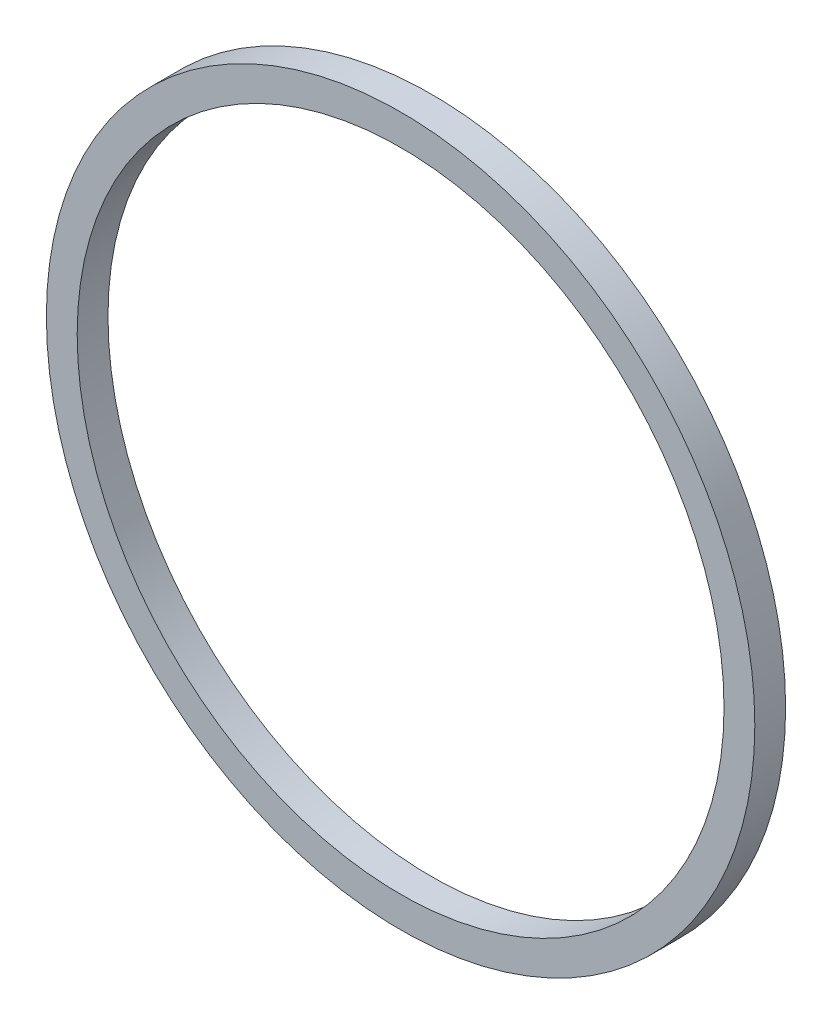
ISO-10303-21;
HEADER;
FILE_DESCRIPTION(('STEP AP214'),'2;1');
FILE_NAME('part.step','',(''),(''),'','','');
FILE_SCHEMA(('AUTOMOTIVE_DESIGN { 1 0 10303 214 1 1 1 1 }'));
ENDSEC;
DATA;
#1=APPLICATION_CONTEXT('core data for automotive mechanical design processes');
#2=APPLICATION_PROTOCOL_DEFINITION('international standard','automotive_design',2000,#1);
#3=PRODUCT_CONTEXT('',#1,'mechanical');
#4=PRODUCT('Part','Part','',(#3));
#5=PRODUCT_RELATED_PRODUCT_CATEGORY('part','',(#4));
#6=PRODUCT_DEFINITION_FORMATION('','',#4);
#7=PRODUCT_DEFINITION_CONTEXT('part definition',#1,'design');
#8=PRODUCT_DEFINITION('design','',#6,#7);
#9=PRODUCT_DEFINITION_SHAPE('','',#8);
#10=(LENGTH_UNIT() NAMED_UNIT(*) SI_UNIT(.MILLI.,.METRE.));
#11=(NAMED_UNIT(*) PLANE_ANGLE_UNIT() SI_UNIT($,.RADIAN.));
#12=(NAMED_UNIT(*) SI_UNIT($,.STERADIAN.) SOLID_ANGLE_UNIT());
#13=UNCERTAINTY_MEASURE_WITH_UNIT(LENGTH_MEASURE(1.E-05),#10,'distance_accuracy_value','');
#14=(GEOMETRIC_REPRESENTATION_CONTEXT(3) GLOBAL_UNCERTAINTY_ASSIGNED_CONTEXT((#13)) GLOBAL_UNIT_ASSIGNED_CONTEXT((#10,
#11,#12)) REPRESENTATION_CONTEXT('',''));
#15=CARTESIAN_POINT('',(0.,0.,0.));
#16=DIRECTION('',(0.,0.,1.));
#17=DIRECTION('',(1.,0.,0.));
#18=AXIS2_PLACEMENT_3D('',#15,#16,#17);
#19=CARTESIAN_POINT('',(0.,0.,2.));
#20=DIRECTION('',(0.,0.,1.));
#21=DIRECTION('',(1.,0.,0.));
#22=AXIS2_PLACEMENT_3D('',#19,#20,#21);
#23=PLANE('',#22);
#24=CARTESIAN_POINT('',(0.,0.,2.));
#25=DIRECTION('',(0.,0.,1.));
#26=DIRECTION('',(1.,0.,0.));
#27=AXIS2_PLACEMENT_3D('',#24,#25,#26);
#28=CIRCLE('',#27,23.);
#29=CARTESIAN_POINT('',(23.,0.,2.));
#30=VERTEX_POINT('',#29);
#31=EDGE_CURVE('E10',#30,#30,#28,.T.);
#32=ORIENTED_EDGE('',*,*,#31,.T.);
#33=EDGE_LOOP('',(#32));
#34=FACE_BOUND('',#33,.T.);
#35=CARTESIAN_POINT('',(0.,0.,2.));
#36=DIRECTION('',(0.,0.,1.));
#37=DIRECTION('',(1.,0.,0.));
#38=AXIS2_PLACEMENT_3D('',#35,#36,#37);
#39=CIRCLE('',#38,21.);
#40=CARTESIAN_POINT('',(21.,0.,2.));
#41=VERTEX_POINT('',#40);
#42=EDGE_CURVE('E48',#41,#41,#39,.T.);
#43=ORIENTED_EDGE('',*,*,#42,.F.);
#44=EDGE_LOOP('',(#43));
#45=FACE_BOUND('',#44,.T.);
#46=ADVANCED_FACE('F37',(#34,#45),#23,.T.);
#47=CARTESIAN_POINT('',(0.,0.,0.));
#48=DIRECTION('',(0.,0.,1.));
#49=DIRECTION('',(1.,0.,0.));
#50=AXIS2_PLACEMENT_3D('',#47,#48,#49);
#51=PLANE('',#50);
#52=CARTESIAN_POINT('',(0.,0.,0.));
#53=DIRECTION('',(0.,0.,1.));
#54=DIRECTION('',(1.,0.,0.));
#55=AXIS2_PLACEMENT_3D('',#52,#53,#54);
#56=CIRCLE('',#55,23.);
#57=CARTESIAN_POINT('',(23.,0.,0.));
#58=VERTEX_POINT('',#57);
#59=EDGE_CURVE('E41',#58,#58,#56,.T.);
#60=ORIENTED_EDGE('',*,*,#59,.F.);
#61=EDGE_LOOP('',(#60));
#62=FACE_BOUND('',#61,.T.);
#63=CARTESIAN_POINT('',(0.,0.,0.));
#64=DIRECTION('',(0.,0.,1.));
#65=DIRECTION('',(1.,0.,0.));
#66=AXIS2_PLACEMENT_3D('',#63,#64,#65);
#67=CIRCLE('',#66,21.);
#68=CARTESIAN_POINT('',(21.,0.,0.));
#69=VERTEX_POINT('',#68);
#70=EDGE_CURVE('E50',#69,#69,#67,.T.);
#71=ORIENTED_EDGE('',*,*,#70,.T.);
#72=EDGE_LOOP('',(#71));
#73=FACE_BOUND('',#72,.T.);
#74=ADVANCED_FACE('F60',(#62,#73),#51,.F.);
#75=CARTESIAN_POINT('',(0.,0.,2.));
#76=DIRECTION('',(0.,0.,-1.));
#77=DIRECTION('',(-1.,0.,0.));
#78=AXIS2_PLACEMENT_3D('',#75,#76,#77);
#79=CYLINDRICAL_SURFACE('',#78,23.);
#80=ORIENTED_EDGE('',*,*,#31,.F.);
#81=EDGE_LOOP('',(#80));
#82=FACE_BOUND('',#81,.T.);
#83=ORIENTED_EDGE('',*,*,#59,.T.);
#84=EDGE_LOOP('',(#83));
#85=FACE_BOUND('',#84,.T.);
#86=ADVANCED_FACE('F39',(#82,#85),#79,.T.);
#87=CARTESIAN_POINT('',(0.,0.,2.));
#88=DIRECTION('',(0.,0.,-1.));
#89=DIRECTION('',(-1.,0.,0.));
#90=AXIS2_PLACEMENT_3D('',#87,#88,#89);
#91=CYLINDRICAL_SURFACE('',#90,21.);
#92=ORIENTED_EDGE('',*,*,#42,.T.);
#93=EDGE_LOOP('',(#92));
#94=FACE_BOUND('',#93,.T.);
#95=ORIENTED_EDGE('',*,*,#70,.F.);
#96=EDGE_LOOP('',(#95));
#97=FACE_BOUND('',#96,.T.);
#98=ADVANCED_FACE('F56',(#94,#97),#91,.F.);
#99=CLOSED_SHELL('',(#46,#74,#86,#98));
#100=MANIFOLD_SOLID_BREP('B2',#99);
#101=ADVANCED_BREP_SHAPE_REPRESENTATION('',(#18,#100),#14);
#102=SHAPE_DEFINITION_REPRESENTATION(#9,#101);
ENDSEC;
END-ISO-10303-21;
